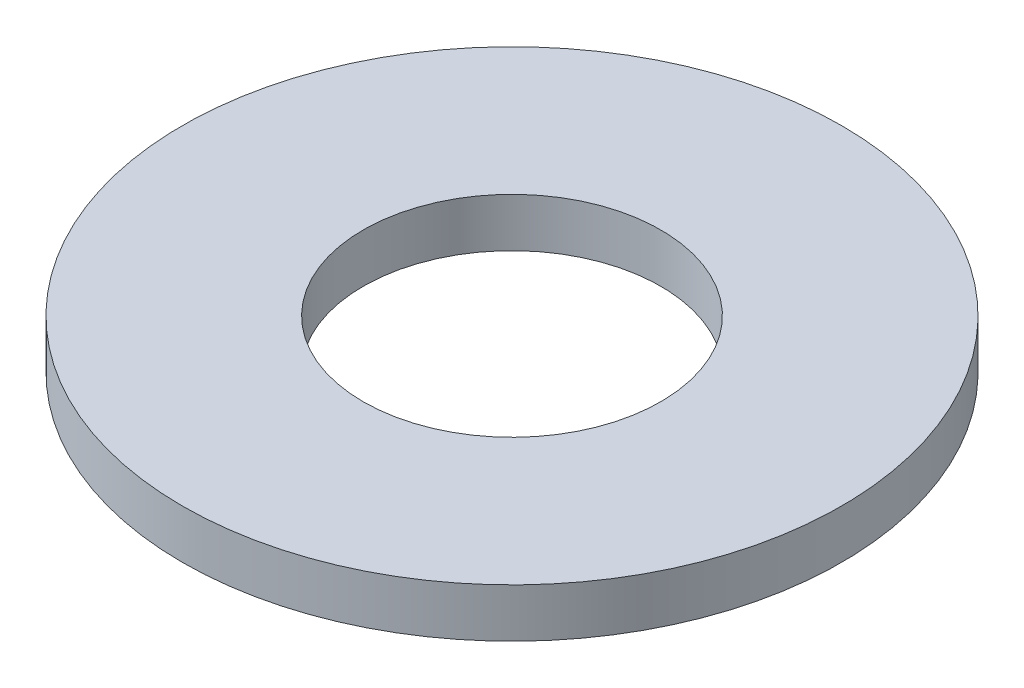
ISO-10303-21;
HEADER;
FILE_DESCRIPTION(('STEP AP214'),'2;1');
FILE_NAME('part.step','',(''),(''),'','','');
FILE_SCHEMA(('AUTOMOTIVE_DESIGN { 1 0 10303 214 1 1 1 1 }'));
ENDSEC;
DATA;
#1=APPLICATION_CONTEXT('core data for automotive mechanical design processes');
#2=APPLICATION_PROTOCOL_DEFINITION('international standard','automotive_design',2000,#1);
#3=PRODUCT_CONTEXT('',#1,'mechanical');
#4=PRODUCT('Part','Part','',(#3));
#5=PRODUCT_RELATED_PRODUCT_CATEGORY('part','',(#4));
#6=PRODUCT_DEFINITION_FORMATION('','',#4);
#7=PRODUCT_DEFINITION_CONTEXT('part definition',#1,'design');
#8=PRODUCT_DEFINITION('design','',#6,#7);
#9=PRODUCT_DEFINITION_SHAPE('','',#8);
#10=(LENGTH_UNIT() NAMED_UNIT(*) SI_UNIT(.MILLI.,.METRE.));
#11=(NAMED_UNIT(*) PLANE_ANGLE_UNIT() SI_UNIT($,.RADIAN.));
#12=(NAMED_UNIT(*) SI_UNIT($,.STERADIAN.) SOLID_ANGLE_UNIT());
#13=UNCERTAINTY_MEASURE_WITH_UNIT(LENGTH_MEASURE(1.E-05),#10,'distance_accuracy_value','');
#14=(GEOMETRIC_REPRESENTATION_CONTEXT(3) GLOBAL_UNCERTAINTY_ASSIGNED_CONTEXT((#13)) GLOBAL_UNIT_ASSIGNED_CONTEXT((#10,
#11,#12)) REPRESENTATION_CONTEXT('',''));
#15=CARTESIAN_POINT('',(0.,0.,0.));
#16=DIRECTION('',(0.,0.,1.));
#17=DIRECTION('',(1.,0.,0.));
#18=AXIS2_PLACEMENT_3D('',#15,#16,#17);
#19=CARTESIAN_POINT('',(0.,0.5,0.));
#20=DIRECTION('',(0.,1.,0.));
#21=DIRECTION('',(0.,0.,1.));
#22=AXIS2_PLACEMENT_3D('',#19,#20,#21);
#23=PLANE('',#22);
#24=CARTESIAN_POINT('',(0.,0.5,0.));
#25=DIRECTION('',(0.,1.,0.));
#26=DIRECTION('',(0.,0.,1.));
#27=AXIS2_PLACEMENT_3D('',#24,#25,#26);
#28=CIRCLE('',#27,3.375);
#29=CARTESIAN_POINT('',(0.,0.5,3.375));
#30=VERTEX_POINT('',#29);
#31=EDGE_CURVE('E10',#30,#30,#28,.T.);
#32=ORIENTED_EDGE('',*,*,#31,.T.);
#33=EDGE_LOOP('',(#32));
#34=FACE_BOUND('',#33,.T.);
#35=CARTESIAN_POINT('',(0.,0.5,0.));
#36=DIRECTION('',(0.,1.,0.));
#37=DIRECTION('',(0.,0.,1.));
#38=AXIS2_PLACEMENT_3D('',#35,#36,#37);
#39=CIRCLE('',#38,1.524);
#40=CARTESIAN_POINT('',(0.,0.5,1.524));
#41=VERTEX_POINT('',#40);
#42=EDGE_CURVE('E42',#41,#41,#39,.T.);
#43=ORIENTED_EDGE('',*,*,#42,.F.);
#44=EDGE_LOOP('',(#43));
#45=FACE_BOUND('',#44,.T.);
#46=ADVANCED_FACE('F31',(#34,#45),#23,.T.);
#47=CARTESIAN_POINT('',(0.,0.,0.));
#48=DIRECTION('',(0.,1.,0.));
#49=DIRECTION('',(0.,0.,1.));
#50=AXIS2_PLACEMENT_3D('',#47,#48,#49);
#51=PLANE('',#50);
#52=CARTESIAN_POINT('',(0.,0.,0.));
#53=DIRECTION('',(0.,1.,0.));
#54=DIRECTION('',(0.,0.,1.));
#55=AXIS2_PLACEMENT_3D('',#52,#53,#54);
#56=CIRCLE('',#55,3.375);
#57=CARTESIAN_POINT('',(0.,0.,3.375));
#58=VERTEX_POINT('',#57);
#59=EDGE_CURVE('E35',#58,#58,#56,.T.);
#60=ORIENTED_EDGE('',*,*,#59,.F.);
#61=EDGE_LOOP('',(#60));
#62=FACE_BOUND('',#61,.T.);
#63=CARTESIAN_POINT('',(0.,0.,0.));
#64=DIRECTION('',(0.,1.,0.));
#65=DIRECTION('',(0.,0.,1.));
#66=AXIS2_PLACEMENT_3D('',#63,#64,#65);
#67=CIRCLE('',#66,1.524);
#68=CARTESIAN_POINT('',(0.,0.,1.524));
#69=VERTEX_POINT('',#68);
#70=EDGE_CURVE('E44',#69,#69,#67,.T.);
#71=ORIENTED_EDGE('',*,*,#70,.T.);
#72=EDGE_LOOP('',(#71));
#73=FACE_BOUND('',#72,.T.);
#74=ADVANCED_FACE('F54',(#62,#73),#51,.F.);
#75=CARTESIAN_POINT('',(0.,0.5,0.));
#76=DIRECTION('',(0.,-1.,0.));
#77=DIRECTION('',(0.,0.,-1.));
#78=AXIS2_PLACEMENT_3D('',#75,#76,#77);
#79=CYLINDRICAL_SURFACE('',#78,3.375);
#80=ORIENTED_EDGE('',*,*,#31,.F.);
#81=EDGE_LOOP('',(#80));
#82=FACE_BOUND('',#81,.T.);
#83=ORIENTED_EDGE('',*,*,#59,.T.);
#84=EDGE_LOOP('',(#83));
#85=FACE_BOUND('',#84,.T.);
#86=ADVANCED_FACE('F33',(#82,#85),#79,.T.);
#87=CARTESIAN_POINT('',(0.,0.5,0.));
#88=DIRECTION('',(0.,-1.,0.));
#89=DIRECTION('',(0.,0.,-1.));
#90=AXIS2_PLACEMENT_3D('',#87,#88,#89);
#91=CYLINDRICAL_SURFACE('',#90,1.524);
#92=ORIENTED_EDGE('',*,*,#42,.T.);
#93=EDGE_LOOP('',(#92));
#94=FACE_BOUND('',#93,.T.);
#95=ORIENTED_EDGE('',*,*,#70,.F.);
#96=EDGE_LOOP('',(#95));
#97=FACE_BOUND('',#96,.T.);
#98=ADVANCED_FACE('F50',(#94,#97),#91,.F.);
#99=CLOSED_SHELL('',(#46,#74,#86,#98));
#100=MANIFOLD_SOLID_BREP('B2',#99);
#101=ADVANCED_BREP_SHAPE_REPRESENTATION('',(#18,#100),#14);
#102=SHAPE_DEFINITION_REPRESENTATION(#9,#101);
ENDSEC;
END-ISO-10303-21;
